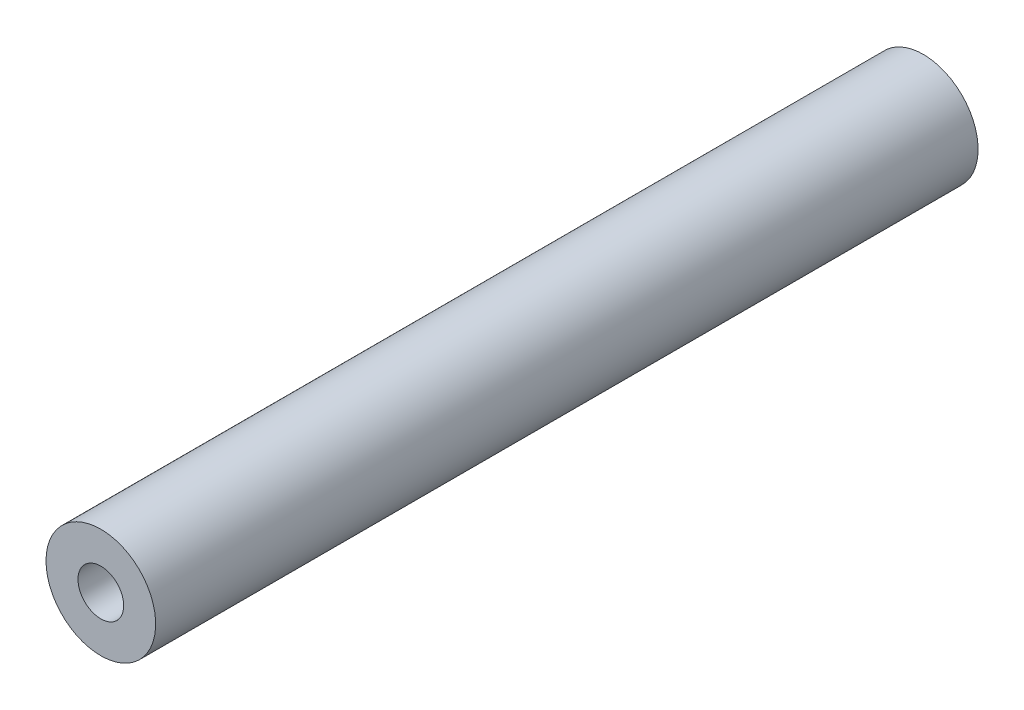
ISO-10303-21;
HEADER;
FILE_DESCRIPTION(('STEP AP214'),'2;1');
FILE_NAME('part.step','',(''),(''),'','','');
FILE_SCHEMA(('AUTOMOTIVE_DESIGN { 1 0 10303 214 1 1 1 1 }'));
ENDSEC;
DATA;
#1=APPLICATION_CONTEXT('core data for automotive mechanical design processes');
#2=APPLICATION_PROTOCOL_DEFINITION('international standard','automotive_design',2000,#1);
#3=PRODUCT_CONTEXT('',#1,'mechanical');
#4=PRODUCT('Part','Part','',(#3));
#5=PRODUCT_RELATED_PRODUCT_CATEGORY('part','',(#4));
#6=PRODUCT_DEFINITION_FORMATION('','',#4);
#7=PRODUCT_DEFINITION_CONTEXT('part definition',#1,'design');
#8=PRODUCT_DEFINITION('design','',#6,#7);
#9=PRODUCT_DEFINITION_SHAPE('','',#8);
#10=(LENGTH_UNIT() NAMED_UNIT(*) SI_UNIT(.MILLI.,.METRE.));
#11=(NAMED_UNIT(*) PLANE_ANGLE_UNIT() SI_UNIT($,.RADIAN.));
#12=(NAMED_UNIT(*) SI_UNIT($,.STERADIAN.) SOLID_ANGLE_UNIT());
#13=UNCERTAINTY_MEASURE_WITH_UNIT(LENGTH_MEASURE(1.E-05),#10,'distance_accuracy_value','');
#14=(GEOMETRIC_REPRESENTATION_CONTEXT(3) GLOBAL_UNCERTAINTY_ASSIGNED_CONTEXT((#13)) GLOBAL_UNIT_ASSIGNED_CONTEXT((#10,
#11,#12)) REPRESENTATION_CONTEXT('',''));
#15=CARTESIAN_POINT('',(0.,0.,0.));
#16=DIRECTION('',(0.,0.,1.));
#17=DIRECTION('',(1.,0.,0.));
#18=AXIS2_PLACEMENT_3D('',#15,#16,#17);
#19=CARTESIAN_POINT('',(0.,0.,45.));
#20=DIRECTION('',(0.,0.,-1.));
#21=DIRECTION('',(-1.,0.,0.));
#22=AXIS2_PLACEMENT_3D('',#19,#20,#21);
#23=CYLINDRICAL_SURFACE('',#22,3.);
#24=CARTESIAN_POINT('',(0.,0.,45.));
#25=DIRECTION('',(0.,0.,1.));
#26=DIRECTION('',(1.,0.,0.));
#27=AXIS2_PLACEMENT_3D('',#24,#25,#26);
#28=CIRCLE('',#27,3.);
#29=CARTESIAN_POINT('',(-3.,0.,45.));
#30=VERTEX_POINT('',#29);
#31=EDGE_CURVE('E11',#30,#30,#28,.T.);
#32=CARTESIAN_POINT('',(0.,0.,0.));
#33=DIRECTION('',(0.,0.,1.));
#34=DIRECTION('',(1.,0.,0.));
#35=AXIS2_PLACEMENT_3D('',#32,#33,#34);
#36=CIRCLE('',#35,3.);
#37=CARTESIAN_POINT('',(-3.,0.,0.));
#38=VERTEX_POINT('',#37);
#39=EDGE_CURVE('E43',#38,#38,#36,.T.);
#40=CARTESIAN_POINT('',(-3.,0.,45.));
#41=CARTESIAN_POINT('',(-3.,0.,44.53125));
#42=CARTESIAN_POINT('',(-3.,0.,44.0625));
#43=CARTESIAN_POINT('',(-3.,0.,43.125));
#44=CARTESIAN_POINT('',(-3.,0.,42.65625));
#45=CARTESIAN_POINT('',(-3.,0.,41.71875));
#46=CARTESIAN_POINT('',(-3.,0.,41.25));
#47=CARTESIAN_POINT('',(-3.,0.,40.3125));
#48=CARTESIAN_POINT('',(-3.,0.,39.84375));
#49=CARTESIAN_POINT('',(-3.,0.,38.90625));
#50=CARTESIAN_POINT('',(-3.,0.,38.4375));
#51=CARTESIAN_POINT('',(-3.,0.,37.5));
#52=CARTESIAN_POINT('',(-3.,0.,37.03125));
#53=CARTESIAN_POINT('',(-3.,0.,36.09375));
#54=CARTESIAN_POINT('',(-3.,0.,35.625));
#55=CARTESIAN_POINT('',(-3.,0.,34.6875));
#56=CARTESIAN_POINT('',(-3.,0.,34.21875));
#57=CARTESIAN_POINT('',(-3.,0.,33.28125));
#58=CARTESIAN_POINT('',(-3.,0.,32.8125));
#59=CARTESIAN_POINT('',(-3.,0.,31.875));
#60=CARTESIAN_POINT('',(-3.,0.,31.40625));
#61=CARTESIAN_POINT('',(-3.,0.,30.46875));
#62=CARTESIAN_POINT('',(-3.,0.,30.));
#63=CARTESIAN_POINT('',(-3.,0.,29.0625));
#64=CARTESIAN_POINT('',(-3.,0.,28.59375));
#65=CARTESIAN_POINT('',(-3.,0.,27.65625));
#66=CARTESIAN_POINT('',(-3.,0.,27.1875));
#67=CARTESIAN_POINT('',(-3.,0.,26.25));
#68=CARTESIAN_POINT('',(-3.,0.,25.78125));
#69=CARTESIAN_POINT('',(-3.,0.,24.84375));
#70=CARTESIAN_POINT('',(-3.,0.,24.375));
#71=CARTESIAN_POINT('',(-3.,0.,23.4375));
#72=CARTESIAN_POINT('',(-3.,0.,22.96875));
#73=CARTESIAN_POINT('',(-3.,0.,22.03125));
#74=CARTESIAN_POINT('',(-3.,0.,21.5625));
#75=CARTESIAN_POINT('',(-3.,0.,20.625));
#76=CARTESIAN_POINT('',(-3.,0.,20.15625));
#77=CARTESIAN_POINT('',(-3.,0.,19.21875));
#78=CARTESIAN_POINT('',(-3.,0.,18.75));
#79=CARTESIAN_POINT('',(-3.,0.,17.8125));
#80=CARTESIAN_POINT('',(-3.,0.,17.34375));
#81=CARTESIAN_POINT('',(-3.,0.,16.40625));
#82=CARTESIAN_POINT('',(-3.,0.,15.9375));
#83=CARTESIAN_POINT('',(-3.,0.,15.));
#84=CARTESIAN_POINT('',(-3.,0.,14.53125));
#85=CARTESIAN_POINT('',(-3.,0.,13.59375));
#86=CARTESIAN_POINT('',(-3.,0.,13.125));
#87=CARTESIAN_POINT('',(-3.,0.,12.1875));
#88=CARTESIAN_POINT('',(-3.,0.,11.71875));
#89=CARTESIAN_POINT('',(-3.,0.,10.78125));
#90=CARTESIAN_POINT('',(-3.,0.,10.3125));
#91=CARTESIAN_POINT('',(-3.,0.,9.375));
#92=CARTESIAN_POINT('',(-3.,0.,8.90625));
#93=CARTESIAN_POINT('',(-3.,0.,7.96874999999999));
#94=CARTESIAN_POINT('',(-3.,0.,7.5));
#95=CARTESIAN_POINT('',(-3.,0.,6.5625));
#96=CARTESIAN_POINT('',(-3.,0.,6.09375));
#97=CARTESIAN_POINT('',(-3.,0.,5.15625));
#98=CARTESIAN_POINT('',(-3.,0.,4.68749999999999));
#99=CARTESIAN_POINT('',(-3.,0.,3.74999999999999));
#100=CARTESIAN_POINT('',(-3.,0.,3.28124999999999));
#101=CARTESIAN_POINT('',(-3.,0.,2.34374999999999));
#102=CARTESIAN_POINT('',(-3.,0.,1.87499999999999));
#103=CARTESIAN_POINT('',(-3.,0.,0.937499999999992));
#104=CARTESIAN_POINT('',(-3.,0.,0.468749999999993));
#105=CARTESIAN_POINT('',(-3.,0.,0.));
#106=B_SPLINE_CURVE_WITH_KNOTS('',3,(#40,#41,#42,#43,#44,#45,#46,#47,#48,#49,#50,#51,#52,#53,
#54,#55,#56,#57,#58,#59,#60,#61,#62,#63,#64,#65,#66,#67,#68,#69,#70,#71,#72,#73,#74,#75,#76,#77,
#78,#79,#80,#81,#82,#83,#84,#85,#86,#87,#88,#89,#90,#91,#92,#93,#94,#95,#96,#97,#98,#99,#100,
#101,#102,#103,#104,#105),.UNSPECIFIED.,.F.,.F.,(4,2,2,2,2,2,2,2,2,2,2,2,2,2,2,2,2,2,2,2,2,2,2,
2,2,2,2,2,2,2,2,2,4),(0.,1.40625,2.8125,4.21875000000001,5.62500000000001,7.03125,8.4375,
9.84375000000001,11.25,12.65625,14.0625,15.46875,16.875,18.28125,19.6875,21.09375,22.5,23.90625,
25.3125,26.71875,28.125,29.53125,30.9375,32.34375,33.75,35.15625,36.5625,37.96875,39.375,
40.78125,42.1875,43.59375,45.),.UNSPECIFIED.);
#107=EDGE_CURVE('BSEAM40',#30,#38,#106,.T.);
#108=ORIENTED_EDGE('',*,*,#31,.F.);
#109=ORIENTED_EDGE('',*,*,#39,.T.);
#110=ORIENTED_EDGE('',*,*,#107,.T.);
#111=ORIENTED_EDGE('',*,*,#107,.F.);
#112=EDGE_LOOP('',(#108,#110,#109,#111));
#113=FACE_BOUND('',#112,.T.);
#114=ADVANCED_FACE('F40',(#113),#23,.T.);
#115=CARTESIAN_POINT('',(0.,0.,45.));
#116=DIRECTION('',(0.,0.,1.));
#117=DIRECTION('',(1.,0.,0.));
#118=AXIS2_PLACEMENT_3D('',#115,#116,#117);
#119=PLANE('',#118);
#120=CARTESIAN_POINT('',(0.,0.,45.));
#121=DIRECTION('',(0.,0.,1.));
#122=DIRECTION('',(1.,0.,0.));
#123=AXIS2_PLACEMENT_3D('',#120,#121,#122);
#124=CIRCLE('',#123,1.25);
#125=CARTESIAN_POINT('',(1.25,0.,45.));
#126=VERTEX_POINT('',#125);
#127=EDGE_CURVE('E65',#126,#126,#124,.T.);
#128=ORIENTED_EDGE('',*,*,#127,.F.);
#129=EDGE_LOOP('',(#128));
#130=FACE_BOUND('',#129,.T.);
#131=ORIENTED_EDGE('',*,*,#31,.T.);
#132=EDGE_LOOP('',(#131));
#133=FACE_BOUND('',#132,.T.);
#134=ADVANCED_FACE('F88',(#130,#133),#119,.T.);
#135=CARTESIAN_POINT('',(0.,0.,0.));
#136=DIRECTION('',(0.,0.,1.));
#137=DIRECTION('',(1.,0.,0.));
#138=AXIS2_PLACEMENT_3D('',#135,#136,#137);
#139=PLANE('',#138);
#140=CARTESIAN_POINT('',(0.,0.,0.));
#141=DIRECTION('',(0.,0.,-1.));
#142=DIRECTION('',(-1.,0.,0.));
#143=AXIS2_PLACEMENT_3D('',#140,#141,#142);
#144=CIRCLE('',#143,1.25);
#145=CARTESIAN_POINT('',(-1.25,0.,0.));
#146=VERTEX_POINT('',#145);
#147=EDGE_CURVE('E66',#146,#146,#144,.T.);
#148=ORIENTED_EDGE('',*,*,#147,.F.);
#149=EDGE_LOOP('',(#148));
#150=FACE_BOUND('',#149,.T.);
#151=ORIENTED_EDGE('',*,*,#39,.F.);
#152=EDGE_LOOP('',(#151));
#153=FACE_BOUND('',#152,.T.);
#154=ADVANCED_FACE('F85',(#150,#153),#139,.F.);
#155=CARTESIAN_POINT('',(0.,0.,37.));
#156=DIRECTION('',(0.,0.,1.));
#157=DIRECTION('',(1.,0.,0.));
#158=AXIS2_PLACEMENT_3D('',#155,#156,#157);
#159=CONICAL_SURFACE('',#158,1.25,1.02974425867665);
#160=CARTESIAN_POINT('',(0.,0.,36.2489242262155));
#161=VERTEX_POINT('',#160);
#162=VERTEX_LOOP('',#161);
#163=FACE_BOUND('',#162,.T.);
#164=CARTESIAN_POINT('',(0.,0.,37.));
#165=DIRECTION('',(0.,0.,1.));
#166=DIRECTION('',(1.,0.,0.));
#167=AXIS2_PLACEMENT_3D('',#164,#165,#166);
#168=CIRCLE('',#167,1.25);
#169=CARTESIAN_POINT('',(1.25,0.,37.));
#170=VERTEX_POINT('',#169);
#171=EDGE_CURVE('E71',#170,#170,#168,.T.);
#172=ORIENTED_EDGE('',*,*,#171,.T.);
#173=EDGE_LOOP('',(#172));
#174=FACE_BOUND('',#173,.T.);
#175=ADVANCED_FACE('F87',(#163,#174),#159,.F.);
#176=CARTESIAN_POINT('',(0.,0.,45.));
#177=DIRECTION('',(0.,0.,1.));
#178=DIRECTION('',(1.,0.,0.));
#179=AXIS2_PLACEMENT_3D('',#176,#177,#178);
#180=CYLINDRICAL_SURFACE('',#179,1.25);
#181=ORIENTED_EDGE('',*,*,#171,.F.);
#182=EDGE_LOOP('',(#181));
#183=FACE_BOUND('',#182,.T.);
#184=ORIENTED_EDGE('',*,*,#127,.T.);
#185=EDGE_LOOP('',(#184));
#186=FACE_BOUND('',#185,.T.);
#187=ADVANCED_FACE('F58',(#183,#186),#180,.F.);
#188=CARTESIAN_POINT('',(0.,0.,8.));
#189=DIRECTION('',(0.,0.,-1.));
#190=DIRECTION('',(-1.,0.,0.));
#191=AXIS2_PLACEMENT_3D('',#188,#189,#190);
#192=CONICAL_SURFACE('',#191,1.25,1.02974425867665);
#193=CARTESIAN_POINT('',(0.,0.,8.75107577378445));
#194=VERTEX_POINT('',#193);
#195=VERTEX_LOOP('',#194);
#196=FACE_BOUND('',#195,.T.);
#197=CARTESIAN_POINT('',(0.,0.,8.));
#198=DIRECTION('',(0.,0.,-1.));
#199=DIRECTION('',(-1.,0.,0.));
#200=AXIS2_PLACEMENT_3D('',#197,#198,#199);
#201=CIRCLE('',#200,1.25);
#202=CARTESIAN_POINT('',(-1.25,0.,8.));
#203=VERTEX_POINT('',#202);
#204=EDGE_CURVE('E62',#203,#203,#201,.T.);
#205=ORIENTED_EDGE('',*,*,#204,.T.);
#206=EDGE_LOOP('',(#205));
#207=FACE_BOUND('',#206,.T.);
#208=ADVANCED_FACE('F54',(#196,#207),#192,.F.);
#209=CARTESIAN_POINT('',(0.,0.,0.));
#210=DIRECTION('',(0.,0.,-1.));
#211=DIRECTION('',(-1.,0.,0.));
#212=AXIS2_PLACEMENT_3D('',#209,#210,#211);
#213=CYLINDRICAL_SURFACE('',#212,1.25);
#214=ORIENTED_EDGE('',*,*,#204,.F.);
#215=EDGE_LOOP('',(#214));
#216=FACE_BOUND('',#215,.T.);
#217=ORIENTED_EDGE('',*,*,#147,.T.);
#218=EDGE_LOOP('',(#217));
#219=FACE_BOUND('',#218,.T.);
#220=ADVANCED_FACE('F57',(#216,#219),#213,.F.);
#221=CLOSED_SHELL('',(#114,#134,#154,#175,#187,#208,#220));
#222=MANIFOLD_SOLID_BREP('B2',#221);
#223=ADVANCED_BREP_SHAPE_REPRESENTATION('',(#18,#222),#14);
#224=SHAPE_DEFINITION_REPRESENTATION(#9,#223);
ENDSEC;
END-ISO-10303-21;
